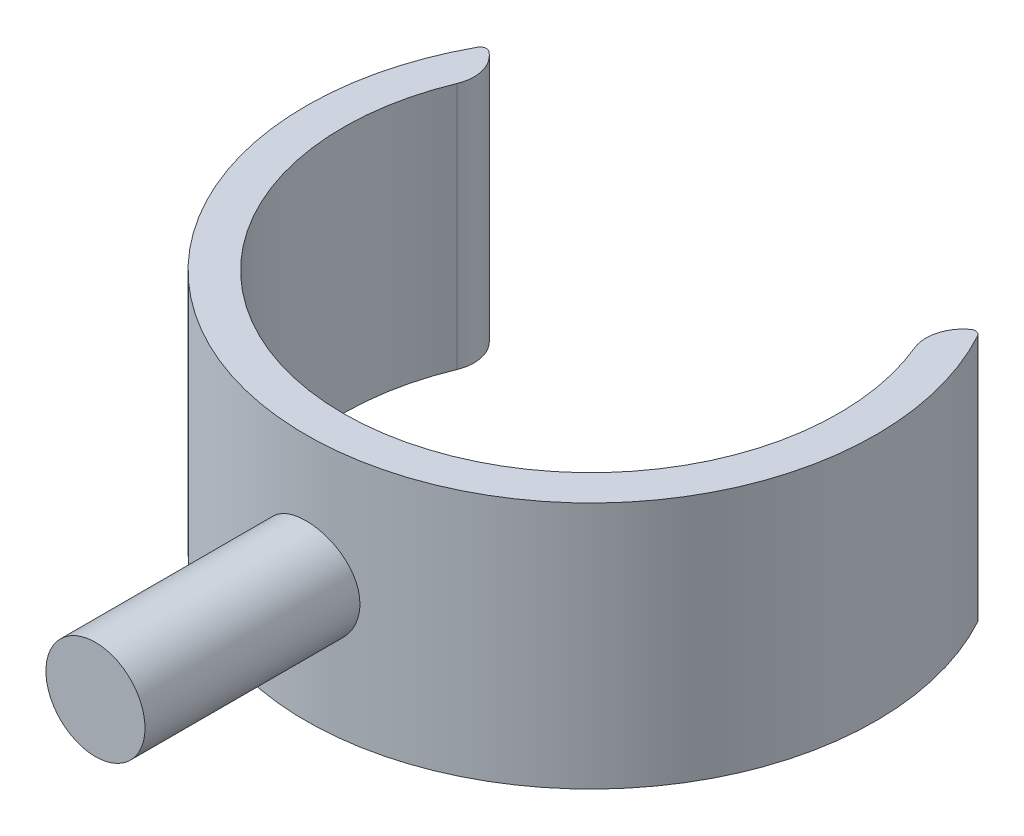
ISO-10303-21;
HEADER;
FILE_DESCRIPTION(('STEP AP214'),'2;1');
FILE_NAME('part.step','',(''),(''),'','','');
FILE_SCHEMA(('AUTOMOTIVE_DESIGN { 1 0 10303 214 1 1 1 1 }'));
ENDSEC;
DATA;
#1=APPLICATION_CONTEXT('core data for automotive mechanical design processes');
#2=APPLICATION_PROTOCOL_DEFINITION('international standard','automotive_design',2000,#1);
#3=PRODUCT_CONTEXT('',#1,'mechanical');
#4=PRODUCT('Part','Part','',(#3));
#5=PRODUCT_RELATED_PRODUCT_CATEGORY('part','',(#4));
#6=PRODUCT_DEFINITION_FORMATION('','',#4);
#7=PRODUCT_DEFINITION_CONTEXT('part definition',#1,'design');
#8=PRODUCT_DEFINITION('design','',#6,#7);
#9=PRODUCT_DEFINITION_SHAPE('','',#8);
#10=(LENGTH_UNIT() NAMED_UNIT(*) SI_UNIT(.MILLI.,.METRE.));
#11=(NAMED_UNIT(*) PLANE_ANGLE_UNIT() SI_UNIT($,.RADIAN.));
#12=(NAMED_UNIT(*) SI_UNIT($,.STERADIAN.) SOLID_ANGLE_UNIT());
#13=UNCERTAINTY_MEASURE_WITH_UNIT(LENGTH_MEASURE(1.E-05),#10,'distance_accuracy_value','');
#14=(GEOMETRIC_REPRESENTATION_CONTEXT(3) GLOBAL_UNCERTAINTY_ASSIGNED_CONTEXT((#13)) GLOBAL_UNIT_ASSIGNED_CONTEXT((#10,
#11,#12)) REPRESENTATION_CONTEXT('',''));
#15=CARTESIAN_POINT('',(0.,0.,0.));
#16=DIRECTION('',(0.,0.,1.));
#17=DIRECTION('',(1.,0.,0.));
#18=AXIS2_PLACEMENT_3D('',#15,#16,#17);
#19=CARTESIAN_POINT('',(0.,20.,0.));
#20=DIRECTION('',(0.,-1.,0.));
#21=DIRECTION('',(0.,0.,-1.));
#22=AXIS2_PLACEMENT_3D('',#19,#20,#21);
#23=CYLINDRICAL_SURFACE('',#22,20.);
#24=CARTESIAN_POINT('',(0.,0.,0.));
#25=DIRECTION('',(0.,1.,0.));
#26=DIRECTION('',(0.,0.,1.));
#27=AXIS2_PLACEMENT_3D('',#24,#25,#26);
#28=CIRCLE('',#27,20.);
#29=CARTESIAN_POINT('',(-18.4768849201144,0.,-7.65537220838088));
#30=VERTEX_POINT('',#29);
#31=CARTESIAN_POINT('',(18.4768849201144,0.,-7.65537220838088));
#32=VERTEX_POINT('',#31);
#33=EDGE_CURVE('E92',#30,#32,#28,.T.);
#34=ORIENTED_EDGE('',*,*,#33,.F.);
#35=DIRECTION('',(0.,-1.,0.));
#36=VECTOR('',#35,1.);
#37=CARTESIAN_POINT('',(-18.4768849201144,20.,-7.65537220838088));
#38=LINE('',#37,#36);
#39=CARTESIAN_POINT('',(-18.4768849201144,20.,-7.65537220838088));
#40=VERTEX_POINT('',#39);
#41=EDGE_CURVE('E102',#30,#40,#38,.F.);
#42=ORIENTED_EDGE('',*,*,#41,.T.);
#43=CARTESIAN_POINT('',(0.,20.,0.));
#44=DIRECTION('',(0.,1.,0.));
#45=DIRECTION('',(0.,0.,1.));
#46=AXIS2_PLACEMENT_3D('',#43,#44,#45);
#47=CIRCLE('',#46,20.);
#48=CARTESIAN_POINT('',(18.4768849201144,20.,-7.65537220838088));
#49=VERTEX_POINT('',#48);
#50=EDGE_CURVE('E139',#40,#49,#47,.T.);
#51=ORIENTED_EDGE('',*,*,#50,.T.);
#52=DIRECTION('',(0.,-1.,0.));
#53=VECTOR('',#52,1.);
#54=CARTESIAN_POINT('',(18.4768849201144,20.,-7.65537220838088));
#55=LINE('',#54,#53);
#56=EDGE_CURVE('E96',#49,#32,#55,.T.);
#57=ORIENTED_EDGE('',*,*,#56,.T.);
#58=EDGE_LOOP('',(#34,#42,#51,#57));
#59=FACE_BOUND('',#58,.T.);
#60=ADVANCED_FACE('F34',(#59),#23,.F.);
#61=CARTESIAN_POINT('',(0.,20.,0.));
#62=DIRECTION('',(0.,-1.,0.));
#63=DIRECTION('',(0.,0.,-1.));
#64=AXIS2_PLACEMENT_3D('',#61,#62,#63);
#65=CYLINDRICAL_SURFACE('',#64,23.);
#66=CARTESIAN_POINT('',(4.,10.,22.6495033058123));
#67=CARTESIAN_POINT('',(3.99999117194802,10.2228512419879,22.6495074411638));
#68=CARTESIAN_POINT('',(3.9813133863309,10.4458205777959,22.6528279655605));
#69=CARTESIAN_POINT('',(3.90713417878178,10.8854927348071,22.6657377102715));
#70=CARTESIAN_POINT('',(3.85159971049601,11.1021897500023,22.67533255614));
#71=CARTESIAN_POINT('',(3.70544671607031,11.5228910801412,22.6996721201073));
#72=CARTESIAN_POINT('',(3.61485863377081,11.7269062312417,22.7144123683723));
#73=CARTESIAN_POINT('',(3.40124739529364,12.1168232320257,22.7473766000173));
#74=CARTESIAN_POINT('',(3.27822751210378,12.3027269069114,22.7656002318065));
#75=CARTESIAN_POINT('',(3.00183807549253,12.6531565354953,22.8036961962379));
#76=CARTESIAN_POINT('',(2.84818846796352,12.8174600991801,22.8235826785326));
#77=CARTESIAN_POINT('',(2.51550640469199,13.1180918813441,22.8626381909444));
#78=CARTESIAN_POINT('',(2.33647239279277,13.2544183834722,22.8818071769853));
#79=CARTESIAN_POINT('',(1.9566558478357,13.4960669289965,22.9174182608498));
#80=CARTESIAN_POINT('',(1.75573914812679,13.6011810666949,22.9338417679921));
#81=CARTESIAN_POINT('',(1.3387663940294,13.7760837008807,22.961953632766));
#82=CARTESIAN_POINT('',(1.12271141200518,13.8458746967114,22.9736423254049));
#83=CARTESIAN_POINT('',(0.6838952662331,13.9474671712844,22.9908676538883));
#84=CARTESIAN_POINT('',(0.461223131092898,13.9796427641919,22.9964648351981));
#85=CARTESIAN_POINT('',(0.0135753078182606,14.0062552093288,23.0010847348104));
#86=CARTESIAN_POINT('',(-0.211400209245964,14.0006948441639,23.0001079378704));
#87=CARTESIAN_POINT('',(-0.65470806963989,13.9522833483005,22.9917376615674));
#88=CARTESIAN_POINT('',(-0.873085884569213,13.9098349047934,22.9844134755682));
#89=CARTESIAN_POINT('',(-1.29957116175896,13.7894872315634,22.9642487613984));
#90=CARTESIAN_POINT('',(-1.50767828961633,13.7115868484046,22.9514080537476));
#91=CARTESIAN_POINT('',(-1.90890245808916,13.5221519653241,22.9215357956325));
#92=CARTESIAN_POINT('',(-2.1019403630422,13.4104532022159,22.9044838543177));
#93=CARTESIAN_POINT('',(-2.4666841709122,13.1567128432997,22.8680807438306));
#94=CARTESIAN_POINT('',(-2.63838819602731,13.0146685794777,22.8487293725561));
#95=CARTESIAN_POINT('',(-2.95797171957842,12.7020406283977,22.8095750365817));
#96=CARTESIAN_POINT('',(-3.1055066858691,12.5311048563083,22.7897694829051));
#97=CARTESIAN_POINT('',(-3.36985951534358,12.1667278950989,22.7521851588863));
#98=CARTESIAN_POINT('',(-3.48667704414271,11.9732864610194,22.7344064106088));
#99=CARTESIAN_POINT('',(-3.68635682882333,11.5689706056388,22.702886479795));
#100=CARTESIAN_POINT('',(-3.7691747381351,11.3580738447661,22.6891505770097));
#101=CARTESIAN_POINT('',(-3.89811026998157,10.9250688591602,22.6673565714152));
#102=CARTESIAN_POINT('',(-3.94423143076393,10.7029617175123,22.6592979212221));
#103=CARTESIAN_POINT('',(-3.99797314608894,10.2569315107682,22.6498775990127));
#104=CARTESIAN_POINT('',(-4.00608612229251,10.0330695294291,22.6484302789321));
#105=CARTESIAN_POINT('',(-3.98489600278975,9.58718756158447,22.6521680042385));
#106=CARTESIAN_POINT('',(-3.95559448674831,9.36516749771024,22.6573527696146));
#107=CARTESIAN_POINT('',(-3.86082797183224,8.93085414255919,22.6736911245835));
#108=CARTESIAN_POINT('',(-3.79561612445694,8.71850390173805,22.6848029143444));
#109=CARTESIAN_POINT('',(-3.63114660634853,8.30774504254548,22.7117079141019));
#110=CARTESIAN_POINT('',(-3.53188673776175,8.10933732518246,22.727501426302));
#111=CARTESIAN_POINT('',(-3.30098631185205,7.72991144578577,22.7621880233053));
#112=CARTESIAN_POINT('',(-3.16903169877286,7.54908714295025,22.7811105404968));
#113=CARTESIAN_POINT('',(-2.87691599472732,7.21197055076681,22.8198380955026));
#114=CARTESIAN_POINT('',(-2.71675273614572,7.05568014840528,22.8396432010496));
#115=CARTESIAN_POINT('',(-2.37057857487036,6.77025583981686,22.8781767674864));
#116=CARTESIAN_POINT('',(-2.18429422949017,6.64145126785398,22.8968904086737));
#117=CARTESIAN_POINT('',(-1.79244446369214,6.41696754580499,22.9308910059359));
#118=CARTESIAN_POINT('',(-1.5868797090464,6.32128725243876,22.9461780802719));
#119=CARTESIAN_POINT('',(-1.1632596983852,6.16627410179646,22.971538920972));
#120=CARTESIAN_POINT('',(-0.94526770850629,6.10677247635122,22.981636859171));
#121=CARTESIAN_POINT('',(-0.502194287430128,6.02526376088675,22.9955841723386));
#122=CARTESIAN_POINT('',(-0.277113495589673,6.00325329925297,22.9994341091943));
#123=CARTESIAN_POINT('',(0.170576573341223,5.99745557297411,23.0004426120729));
#124=CARTESIAN_POINT('',(0.393179337294098,6.01316847649925,22.9976886794509));
#125=CARTESIAN_POINT('',(0.832523115587743,6.08128578035176,22.9859785677234));
#126=CARTESIAN_POINT('',(1.04926417009517,6.13368992919063,22.9770224311291));
#127=CARTESIAN_POINT('',(1.47051647200792,6.27350389757407,22.9539116491458));
#128=CARTESIAN_POINT('',(1.67504342458576,6.3608676007638,22.9397638542843));
#129=CARTESIAN_POINT('',(2.06661239541964,6.56806375825254,22.9078098192122));
#130=CARTESIAN_POINT('',(2.25365346653024,6.68789796998976,22.8900033809931));
#131=CARTESIAN_POINT('',(2.60745033808327,6.95838836283245,22.8524241432882));
#132=CARTESIAN_POINT('',(2.77392524063614,7.10940898212868,22.8326296620843));
#133=CARTESIAN_POINT('',(3.07934529091734,7.43722287648137,22.7934508633716));
#134=CARTESIAN_POINT('',(3.21828397809146,7.61402218289194,22.7740666430688));
#135=CARTESIAN_POINT('',(3.46568966096228,7.99001380358019,22.7377394964504));
#136=CARTESIAN_POINT('',(3.57391105312407,8.18936970873457,22.7208167471236));
#137=CARTESIAN_POINT('',(3.7551599348753,8.60365062113122,22.6915683289933));
#138=CARTESIAN_POINT('',(3.82822193868825,8.81856012072937,22.6792381545864));
#139=CARTESIAN_POINT('',(3.92154918667684,9.19520133474036,22.6632511859548));
#140=CARTESIAN_POINT('',(3.95091998279165,9.35467633522221,22.6581250394677));
#141=CARTESIAN_POINT('',(3.990148393735,9.67608012500975,22.6512496317505));
#142=CARTESIAN_POINT('',(4.00000641713354,9.8380088628661,22.6495002998147));
#143=CARTESIAN_POINT('',(4.,10.,22.6495033058123));
#144=B_SPLINE_CURVE_WITH_KNOTS('',3,(#66,#67,#68,#69,#70,#71,#72,#73,#74,#75,#76,#77,#78,#79,
#80,#81,#82,#83,#84,#85,#86,#87,#88,#89,#90,#91,#92,#93,#94,#95,#96,#97,#98,#99,#100,#101,#102,
#103,#104,#105,#106,#107,#108,#109,#110,#111,#112,#113,#114,#115,#116,#117,#118,#119,#120,#121,
#122,#123,#124,#125,#126,#127,#128,#129,#130,#131,#132,#133,#134,#135,#136,#137,#138,#139,#140,
#141,#142,#143),.UNSPECIFIED.,.T.,.F.,(4,2,2,2,2,2,2,2,2,2,2,2,2,2,2,2,2,2,2,2,2,2,2,2,2,2,2,2,
2,2,2,2,2,2,2,2,2,2,4),(0.,0.667961212278693,1.33652214098103,2.00450372728369,2.67241792728161,
3.34674493375312,4.02111329682081,4.69987774618159,5.37859416180418,6.05050119040793,
6.72235867390646,7.38697269724159,8.05160834547249,8.71952753041108,9.38750546381502,
10.0643037841885,10.7411094717657,11.4187951508199,12.096415480476,12.7652320456334,
13.4340203738416,14.0981533090132,14.7623291230874,15.4331505161702,16.104023479173,
16.7825321350981,17.4610173700505,18.1363127904026,18.8115474776148,19.4778848392844,
20.1442176338007,20.809674328119,21.4751670469028,22.1489279224173,22.8228466892385,
23.5020111055593,24.180507453012,24.6660603316036,25.1516030432938),.UNSPECIFIED.);
#145=CARTESIAN_POINT('',(4.,10.,22.6495033058123));
#146=VERTEX_POINT('',#145);
#147=EDGE_CURVE('E106',#146,#146,#144,.T.);
#148=ORIENTED_EDGE('',*,*,#147,.F.);
#149=EDGE_LOOP('',(#148));
#150=FACE_BOUND('',#149,.T.);
#151=CARTESIAN_POINT('',(0.,0.,0.));
#152=DIRECTION('',(0.,1.,0.));
#153=DIRECTION('',(0.,0.,1.));
#154=AXIS2_PLACEMENT_3D('',#151,#152,#153);
#155=CIRCLE('',#154,23.);
#156=CARTESIAN_POINT('',(-20.1786650746435,0.,-11.0372766480397));
#157=VERTEX_POINT('',#156);
#158=CARTESIAN_POINT('',(20.1786650746435,0.,-11.0372766480397));
#159=VERTEX_POINT('',#158);
#160=EDGE_CURVE('E105',#157,#159,#155,.T.);
#161=ORIENTED_EDGE('',*,*,#160,.T.);
#162=DIRECTION('',(0.,-1.,0.));
#163=VECTOR('',#162,1.);
#164=CARTESIAN_POINT('',(20.1786650746435,20.,-11.0372766480397));
#165=LINE('',#164,#163);
#166=CARTESIAN_POINT('',(20.1786650746435,20.,-11.0372766480397));
#167=VERTEX_POINT('',#166);
#168=EDGE_CURVE('E55',#159,#167,#165,.F.);
#169=ORIENTED_EDGE('',*,*,#168,.T.);
#170=CARTESIAN_POINT('',(0.,20.,0.));
#171=DIRECTION('',(0.,1.,0.));
#172=DIRECTION('',(0.,0.,1.));
#173=AXIS2_PLACEMENT_3D('',#170,#171,#172);
#174=CIRCLE('',#173,23.);
#175=CARTESIAN_POINT('',(-20.1786650746435,20.,-11.0372766480397));
#176=VERTEX_POINT('',#175);
#177=EDGE_CURVE('E131',#176,#167,#174,.T.);
#178=ORIENTED_EDGE('',*,*,#177,.F.);
#179=DIRECTION('',(0.,-1.,0.));
#180=VECTOR('',#179,1.);
#181=CARTESIAN_POINT('',(-20.1786650746435,20.,-11.0372766480397));
#182=LINE('',#181,#180);
#183=EDGE_CURVE('E122',#176,#157,#182,.T.);
#184=ORIENTED_EDGE('',*,*,#183,.T.);
#185=EDGE_LOOP('',(#161,#169,#178,#184));
#186=FACE_BOUND('',#185,.T.);
#187=ADVANCED_FACE('F137',(#150,#186),#65,.T.);
#188=CARTESIAN_POINT('',(-44.8659252662864,20.,5.75000000000003));
#189=DIRECTION('',(0.,1.,0.));
#190=DIRECTION('',(0.,0.,1.));
#191=AXIS2_PLACEMENT_3D('',#188,#189,#190);
#192=PLANE('',#191);
#193=ORIENTED_EDGE('',*,*,#177,.T.);
#194=CARTESIAN_POINT('',(19.739998442586,20.,-10.7973358513432));
#195=DIRECTION('',(0.,1.,0.));
#196=DIRECTION('',(0.,0.,1.));
#197=AXIS2_PLACEMENT_3D('',#194,#195,#196);
#198=CIRCLE('',#197,0.5);
#199=CARTESIAN_POINT('',(19.4383145994769,20.,-11.1960674136842));
#200=VERTEX_POINT('',#199);
#201=EDGE_CURVE('E42',#167,#200,#198,.T.);
#202=ORIENTED_EDGE('',*,*,#201,.T.);
#203=CARTESIAN_POINT('',(21.2484176581315,20.,-8.80367803963801));
#204=DIRECTION('',(0.,1.,0.));
#205=DIRECTION('',(0.,0.,1.));
#206=AXIS2_PLACEMENT_3D('',#203,#204,#205);
#207=CIRCLE('',#206,3.);
#208=EDGE_CURVE('E110',#200,#49,#207,.T.);
#209=ORIENTED_EDGE('',*,*,#208,.T.);
#210=ORIENTED_EDGE('',*,*,#50,.F.);
#211=CARTESIAN_POINT('',(-21.2484176581315,20.,-8.80367803963801));
#212=DIRECTION('',(0.,1.,0.));
#213=DIRECTION('',(0.,0.,1.));
#214=AXIS2_PLACEMENT_3D('',#211,#212,#213);
#215=CIRCLE('',#214,3.);
#216=CARTESIAN_POINT('',(-19.4383145994769,20.,-11.1960674136842));
#217=VERTEX_POINT('',#216);
#218=EDGE_CURVE('E109',#40,#217,#215,.T.);
#219=ORIENTED_EDGE('',*,*,#218,.T.);
#220=CARTESIAN_POINT('',(-19.739998442586,20.,-10.7973358513432));
#221=DIRECTION('',(0.,1.,0.));
#222=DIRECTION('',(0.,0.,1.));
#223=AXIS2_PLACEMENT_3D('',#220,#221,#222);
#224=CIRCLE('',#223,0.5);
#225=EDGE_CURVE('E126',#217,#176,#224,.T.);
#226=ORIENTED_EDGE('',*,*,#225,.T.);
#227=EDGE_LOOP('',(#193,#202,#209,#210,#219,#226));
#228=FACE_BOUND('',#227,.T.);
#229=ADVANCED_FACE('F130',(#228),#192,.T.);
#230=CARTESIAN_POINT('',(-44.8659252662864,0.,5.75000000000003));
#231=DIRECTION('',(0.,1.,0.));
#232=DIRECTION('',(0.,0.,1.));
#233=AXIS2_PLACEMENT_3D('',#230,#231,#232);
#234=PLANE('',#233);
#235=CARTESIAN_POINT('',(21.2484176581315,0.,-8.80367803963801));
#236=DIRECTION('',(0.,1.,0.));
#237=DIRECTION('',(0.,0.,1.));
#238=AXIS2_PLACEMENT_3D('',#235,#236,#237);
#239=CIRCLE('',#238,3.);
#240=CARTESIAN_POINT('',(19.4383145994769,0.,-11.1960674136842));
#241=VERTEX_POINT('',#240);
#242=EDGE_CURVE('E97',#32,#241,#239,.F.);
#243=ORIENTED_EDGE('',*,*,#242,.T.);
#244=CARTESIAN_POINT('',(19.739998442586,0.,-10.7973358513432));
#245=DIRECTION('',(0.,1.,0.));
#246=DIRECTION('',(0.,0.,1.));
#247=AXIS2_PLACEMENT_3D('',#244,#245,#246);
#248=CIRCLE('',#247,0.5);
#249=EDGE_CURVE('E120',#241,#159,#248,.F.);
#250=ORIENTED_EDGE('',*,*,#249,.T.);
#251=ORIENTED_EDGE('',*,*,#160,.F.);
#252=CARTESIAN_POINT('',(-19.739998442586,0.,-10.7973358513432));
#253=DIRECTION('',(0.,1.,0.));
#254=DIRECTION('',(0.,0.,1.));
#255=AXIS2_PLACEMENT_3D('',#252,#253,#254);
#256=CIRCLE('',#255,0.5);
#257=CARTESIAN_POINT('',(-19.4383145994769,0.,-11.1960674136842));
#258=VERTEX_POINT('',#257);
#259=EDGE_CURVE('E94',#157,#258,#256,.F.);
#260=ORIENTED_EDGE('',*,*,#259,.T.);
#261=CARTESIAN_POINT('',(-21.2484176581315,0.,-8.80367803963801));
#262=DIRECTION('',(0.,1.,0.));
#263=DIRECTION('',(0.,0.,1.));
#264=AXIS2_PLACEMENT_3D('',#261,#262,#263);
#265=CIRCLE('',#264,3.);
#266=EDGE_CURVE('E88',#258,#30,#265,.F.);
#267=ORIENTED_EDGE('',*,*,#266,.T.);
#268=ORIENTED_EDGE('',*,*,#33,.T.);
#269=EDGE_LOOP('',(#243,#250,#251,#260,#267,#268));
#270=FACE_BOUND('',#269,.T.);
#271=ADVANCED_FACE('F91',(#270),#234,.F.);
#272=CARTESIAN_POINT('',(0.,10.,40.));
#273=DIRECTION('',(0.,0.,1.));
#274=DIRECTION('',(1.,0.,0.));
#275=AXIS2_PLACEMENT_3D('',#272,#273,#274);
#276=PLANE('',#275);
#277=CARTESIAN_POINT('',(0.,10.,40.));
#278=DIRECTION('',(0.,0.,1.));
#279=DIRECTION('',(1.,0.,0.));
#280=AXIS2_PLACEMENT_3D('',#277,#278,#279);
#281=CIRCLE('',#280,4.);
#282=CARTESIAN_POINT('',(4.,10.,40.));
#283=VERTEX_POINT('',#282);
#284=EDGE_CURVE('E151',#283,#283,#281,.T.);
#285=ORIENTED_EDGE('',*,*,#284,.T.);
#286=EDGE_LOOP('',(#285));
#287=FACE_BOUND('',#286,.T.);
#288=ADVANCED_FACE('F157',(#287),#276,.T.);
#289=CARTESIAN_POINT('',(0.,10.,-11.501));
#290=DIRECTION('',(0.,0.,1.));
#291=DIRECTION('',(1.,0.,0.));
#292=AXIS2_PLACEMENT_3D('',#289,#290,#291);
#293=CYLINDRICAL_SURFACE('',#292,4.);
#294=ORIENTED_EDGE('',*,*,#284,.F.);
#295=EDGE_LOOP('',(#294));
#296=FACE_BOUND('',#295,.T.);
#297=ORIENTED_EDGE('',*,*,#147,.T.);
#298=EDGE_LOOP('',(#297));
#299=FACE_BOUND('',#298,.T.);
#300=ADVANCED_FACE('F152',(#296,#299),#293,.T.);
#301=CARTESIAN_POINT('',(-21.2484176581315,20.,-8.80367803963801));
#302=DIRECTION('',(0.,-1.,0.));
#303=DIRECTION('',(0.,0.,-1.));
#304=AXIS2_PLACEMENT_3D('',#301,#302,#303);
#305=CYLINDRICAL_SURFACE('',#304,3.);
#306=ORIENTED_EDGE('',*,*,#266,.F.);
#307=DIRECTION('',(0.,-1.,0.));
#308=VECTOR('',#307,1.);
#309=CARTESIAN_POINT('',(-19.4383145994769,20.,-11.1960674136842));
#310=LINE('',#309,#308);
#311=EDGE_CURVE('E11',#258,#217,#310,.F.);
#312=ORIENTED_EDGE('',*,*,#311,.T.);
#313=ORIENTED_EDGE('',*,*,#218,.F.);
#314=ORIENTED_EDGE('',*,*,#41,.F.);
#315=EDGE_LOOP('',(#306,#312,#313,#314));
#316=FACE_BOUND('',#315,.T.);
#317=ADVANCED_FACE('F108',(#316),#305,.T.);
#318=CARTESIAN_POINT('',(21.2484176581315,20.,-8.80367803963801));
#319=DIRECTION('',(0.,-1.,0.));
#320=DIRECTION('',(0.,0.,-1.));
#321=AXIS2_PLACEMENT_3D('',#318,#319,#320);
#322=CYLINDRICAL_SURFACE('',#321,3.);
#323=ORIENTED_EDGE('',*,*,#208,.F.);
#324=DIRECTION('',(0.,-1.,0.));
#325=VECTOR('',#324,1.);
#326=CARTESIAN_POINT('',(19.4383145994769,20.,-11.1960674136842));
#327=LINE('',#326,#325);
#328=EDGE_CURVE('E116',#200,#241,#327,.T.);
#329=ORIENTED_EDGE('',*,*,#328,.T.);
#330=ORIENTED_EDGE('',*,*,#242,.F.);
#331=ORIENTED_EDGE('',*,*,#56,.F.);
#332=EDGE_LOOP('',(#323,#329,#330,#331));
#333=FACE_BOUND('',#332,.T.);
#334=ADVANCED_FACE('F135',(#333),#322,.T.);
#335=CARTESIAN_POINT('',(19.739998442586,20.,-10.7973358513432));
#336=DIRECTION('',(0.,-1.,0.));
#337=DIRECTION('',(0.,0.,-1.));
#338=AXIS2_PLACEMENT_3D('',#335,#336,#337);
#339=CYLINDRICAL_SURFACE('',#338,0.5);
#340=ORIENTED_EDGE('',*,*,#201,.F.);
#341=ORIENTED_EDGE('',*,*,#168,.F.);
#342=ORIENTED_EDGE('',*,*,#249,.F.);
#343=ORIENTED_EDGE('',*,*,#328,.F.);
#344=EDGE_LOOP('',(#340,#341,#342,#343));
#345=FACE_BOUND('',#344,.T.);
#346=ADVANCED_FACE('F136',(#345),#339,.T.);
#347=CARTESIAN_POINT('',(-19.739998442586,20.,-10.7973358513432));
#348=DIRECTION('',(0.,-1.,0.));
#349=DIRECTION('',(0.,0.,-1.));
#350=AXIS2_PLACEMENT_3D('',#347,#348,#349);
#351=CYLINDRICAL_SURFACE('',#350,0.5);
#352=ORIENTED_EDGE('',*,*,#225,.F.);
#353=ORIENTED_EDGE('',*,*,#311,.F.);
#354=ORIENTED_EDGE('',*,*,#259,.F.);
#355=ORIENTED_EDGE('',*,*,#183,.F.);
#356=EDGE_LOOP('',(#352,#353,#354,#355));
#357=FACE_BOUND('',#356,.T.);
#358=ADVANCED_FACE('F36',(#357),#351,.T.);
#359=CLOSED_SHELL('',(#60,#187,#229,#271,#288,#300,#317,#334,#346,#358));
#360=MANIFOLD_SOLID_BREP('B2',#359);
#361=ADVANCED_BREP_SHAPE_REPRESENTATION('',(#18,#360),#14);
#362=SHAPE_DEFINITION_REPRESENTATION(#9,#361);
ENDSEC;
END-ISO-10303-21;
